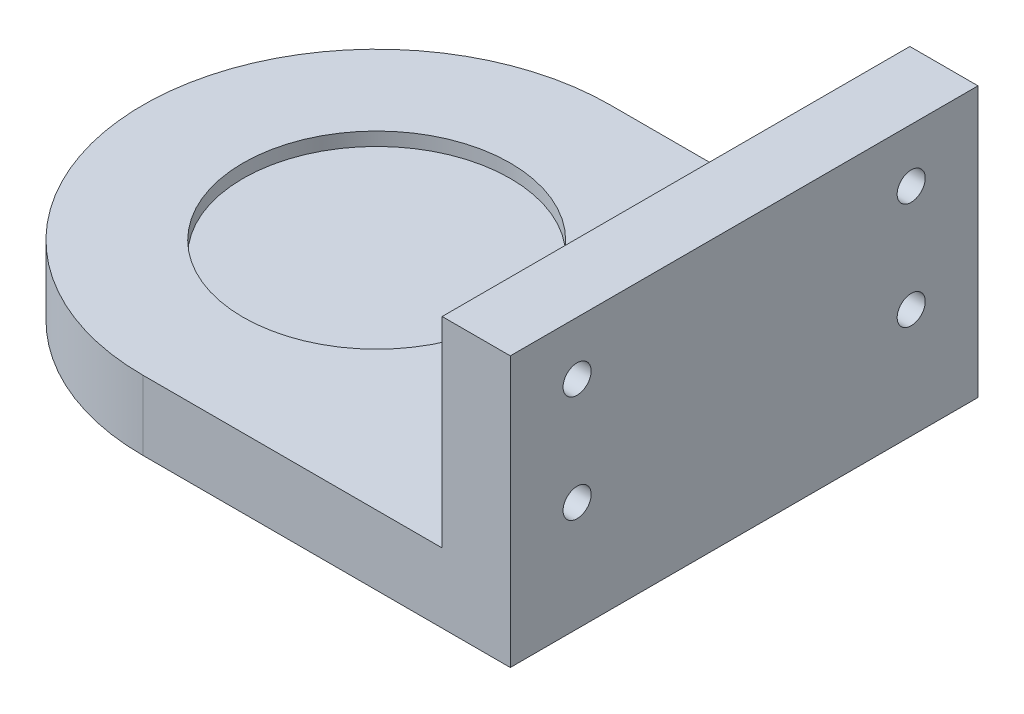
ISO-10303-21;
HEADER;
FILE_DESCRIPTION(('STEP AP214'),'2;1');
FILE_NAME('part.step','',(''),(''),'','','');
FILE_SCHEMA(('AUTOMOTIVE_DESIGN { 1 0 10303 214 1 1 1 1 }'));
ENDSEC;
DATA;
#1=APPLICATION_CONTEXT('core data for automotive mechanical design processes');
#2=APPLICATION_PROTOCOL_DEFINITION('international standard','automotive_design',2000,#1);
#3=PRODUCT_CONTEXT('',#1,'mechanical');
#4=PRODUCT('Part','Part','',(#3));
#5=PRODUCT_RELATED_PRODUCT_CATEGORY('part','',(#4));
#6=PRODUCT_DEFINITION_FORMATION('','',#4);
#7=PRODUCT_DEFINITION_CONTEXT('part definition',#1,'design');
#8=PRODUCT_DEFINITION('design','',#6,#7);
#9=PRODUCT_DEFINITION_SHAPE('','',#8);
#10=(LENGTH_UNIT() NAMED_UNIT(*) SI_UNIT(.MILLI.,.METRE.));
#11=(NAMED_UNIT(*) PLANE_ANGLE_UNIT() SI_UNIT($,.RADIAN.));
#12=(NAMED_UNIT(*) SI_UNIT($,.STERADIAN.) SOLID_ANGLE_UNIT());
#13=UNCERTAINTY_MEASURE_WITH_UNIT(LENGTH_MEASURE(1.E-05),#10,'distance_accuracy_value','');
#14=(GEOMETRIC_REPRESENTATION_CONTEXT(3) GLOBAL_UNCERTAINTY_ASSIGNED_CONTEXT((#13)) GLOBAL_UNIT_ASSIGNED_CONTEXT((#10,
#11,#12)) REPRESENTATION_CONTEXT('',''));
#15=CARTESIAN_POINT('',(0.,0.,0.));
#16=DIRECTION('',(0.,0.,1.));
#17=DIRECTION('',(1.,0.,0.));
#18=AXIS2_PLACEMENT_3D('',#15,#16,#17);
#19=CARTESIAN_POINT('',(0.,0.,0.));
#20=DIRECTION('',(0.,1.,0.));
#21=DIRECTION('',(0.,0.,1.));
#22=AXIS2_PLACEMENT_3D('',#19,#20,#21);
#23=PLANE('',#22);
#24=CARTESIAN_POINT('',(0.,0.,0.));
#25=DIRECTION('',(0.,1.,0.));
#26=DIRECTION('',(0.,0.,1.));
#27=AXIS2_PLACEMENT_3D('',#24,#25,#26);
#28=CIRCLE('',#27,20.);
#29=CARTESIAN_POINT('',(0.,0.,20.));
#30=VERTEX_POINT('',#29);
#31=EDGE_CURVE('E162',#30,#30,#28,.T.);
#32=ORIENTED_EDGE('',*,*,#31,.F.);
#33=EDGE_LOOP('',(#32));
#34=FACE_BOUND('',#33,.T.);
#35=DIRECTION('',(1.,0.,0.));
#36=VECTOR('',#35,1.);
#37=CARTESIAN_POINT('',(55.,0.,35.));
#38=LINE('',#37,#36);
#39=CARTESIAN_POINT('',(0.,0.,35.));
#40=VERTEX_POINT('',#39);
#41=CARTESIAN_POINT('',(44.8,0.,35.));
#42=VERTEX_POINT('',#41);
#43=EDGE_CURVE('E180',#40,#42,#38,.T.);
#44=ORIENTED_EDGE('',*,*,#43,.T.);
#45=DIRECTION('',(0.,0.,-1.));
#46=VECTOR('',#45,1.);
#47=CARTESIAN_POINT('',(44.8,0.,35.));
#48=LINE('',#47,#46);
#49=CARTESIAN_POINT('',(44.8,0.,-35.));
#50=VERTEX_POINT('',#49);
#51=EDGE_CURVE('E114',#42,#50,#48,.T.);
#52=ORIENTED_EDGE('',*,*,#51,.T.);
#53=DIRECTION('',(-1.,0.,0.));
#54=VECTOR('',#53,1.);
#55=CARTESIAN_POINT('',(0.,0.,-35.));
#56=LINE('',#55,#54);
#57=CARTESIAN_POINT('',(0.,0.,-35.));
#58=VERTEX_POINT('',#57);
#59=EDGE_CURVE('E71',#50,#58,#56,.T.);
#60=ORIENTED_EDGE('',*,*,#59,.T.);
#61=CARTESIAN_POINT('',(0.,0.,0.));
#62=DIRECTION('',(0.,1.,0.));
#63=DIRECTION('',(0.,0.,1.));
#64=AXIS2_PLACEMENT_3D('',#61,#62,#63);
#65=CIRCLE('',#64,35.);
#66=EDGE_CURVE('E135',#58,#40,#65,.T.);
#67=ORIENTED_EDGE('',*,*,#66,.T.);
#68=EDGE_LOOP('',(#44,#52,#60,#67));
#69=FACE_BOUND('',#68,.T.);
#70=ADVANCED_FACE('F31',(#34,#69),#23,.T.);
#71=CARTESIAN_POINT('',(0.,-10.4,0.));
#72=DIRECTION('',(0.,1.,0.));
#73=DIRECTION('',(0.,0.,1.));
#74=AXIS2_PLACEMENT_3D('',#71,#72,#73);
#75=CYLINDRICAL_SURFACE('',#74,35.);
#76=ORIENTED_EDGE('',*,*,#66,.F.);
#77=DIRECTION('',(0.,1.,0.));
#78=VECTOR('',#77,1.);
#79=CARTESIAN_POINT('',(0.,-10.4,-35.));
#80=LINE('',#79,#78);
#81=CARTESIAN_POINT('',(0.,-10.4,-35.));
#82=VERTEX_POINT('',#81);
#83=EDGE_CURVE('E11',#82,#58,#80,.T.);
#84=ORIENTED_EDGE('',*,*,#83,.F.);
#85=CARTESIAN_POINT('',(0.,-10.4,0.));
#86=DIRECTION('',(0.,1.,0.));
#87=DIRECTION('',(0.,0.,1.));
#88=AXIS2_PLACEMENT_3D('',#85,#86,#87);
#89=CIRCLE('',#88,35.);
#90=CARTESIAN_POINT('',(0.,-10.4,35.));
#91=VERTEX_POINT('',#90);
#92=EDGE_CURVE('E128',#82,#91,#89,.T.);
#93=ORIENTED_EDGE('',*,*,#92,.T.);
#94=DIRECTION('',(0.,1.,0.));
#95=VECTOR('',#94,1.);
#96=CARTESIAN_POINT('',(0.,-10.4,35.));
#97=LINE('',#96,#95);
#98=EDGE_CURVE('E77',#91,#40,#97,.T.);
#99=ORIENTED_EDGE('',*,*,#98,.T.);
#100=EDGE_LOOP('',(#76,#84,#93,#99));
#101=FACE_BOUND('',#100,.T.);
#102=ADVANCED_FACE('F33',(#101),#75,.T.);
#103=CARTESIAN_POINT('',(0.,-10.4,-35.));
#104=DIRECTION('',(0.,0.,-1.));
#105=DIRECTION('',(-1.,0.,0.));
#106=AXIS2_PLACEMENT_3D('',#103,#104,#105);
#107=PLANE('',#106);
#108=ORIENTED_EDGE('',*,*,#59,.F.);
#109=DIRECTION('',(0.,-1.,0.));
#110=VECTOR('',#109,1.);
#111=CARTESIAN_POINT('',(44.8,30.,-35.));
#112=LINE('',#111,#110);
#113=CARTESIAN_POINT('',(44.8,30.,-35.));
#114=VERTEX_POINT('',#113);
#115=EDGE_CURVE('E48',#114,#50,#112,.T.);
#116=ORIENTED_EDGE('',*,*,#115,.F.);
#117=DIRECTION('',(1.,0.,0.));
#118=VECTOR('',#117,1.);
#119=CARTESIAN_POINT('',(55.,30.,-35.));
#120=LINE('',#119,#118);
#121=CARTESIAN_POINT('',(55.,30.,-35.));
#122=VERTEX_POINT('',#121);
#123=EDGE_CURVE('E123',#114,#122,#120,.T.);
#124=ORIENTED_EDGE('',*,*,#123,.T.);
#125=DIRECTION('',(0.,1.,0.));
#126=VECTOR('',#125,1.);
#127=CARTESIAN_POINT('',(55.,-10.4,-35.));
#128=LINE('',#127,#126);
#129=CARTESIAN_POINT('',(55.,-10.4,-35.));
#130=VERTEX_POINT('',#129);
#131=EDGE_CURVE('E40',#130,#122,#128,.T.);
#132=ORIENTED_EDGE('',*,*,#131,.F.);
#133=DIRECTION('',(-1.,0.,0.));
#134=VECTOR('',#133,1.);
#135=CARTESIAN_POINT('',(0.,-10.4,-35.));
#136=LINE('',#135,#134);
#137=EDGE_CURVE('E188',#130,#82,#136,.T.);
#138=ORIENTED_EDGE('',*,*,#137,.T.);
#139=ORIENTED_EDGE('',*,*,#83,.T.);
#140=EDGE_LOOP('',(#108,#116,#124,#132,#138,#139));
#141=FACE_BOUND('',#140,.T.);
#142=ADVANCED_FACE('F196',(#141),#107,.T.);
#143=CARTESIAN_POINT('',(55.,-10.4,-35.));
#144=DIRECTION('',(1.,0.,0.));
#145=DIRECTION('',(0.,0.,-1.));
#146=AXIS2_PLACEMENT_3D('',#143,#144,#145);
#147=PLANE('',#146);
#148=CARTESIAN_POINT('',(55.,22.,25.));
#149=DIRECTION('',(1.,0.,0.));
#150=DIRECTION('',(0.,0.,1.));
#151=AXIS2_PLACEMENT_3D('',#148,#149,#150);
#152=CIRCLE('',#151,2.1);
#153=CARTESIAN_POINT('',(55.,22.,22.9));
#154=VERTEX_POINT('',#153);
#155=EDGE_CURVE('E157',#154,#154,#152,.T.);
#156=ORIENTED_EDGE('',*,*,#155,.F.);
#157=EDGE_LOOP('',(#156));
#158=FACE_BOUND('',#157,.T.);
#159=CARTESIAN_POINT('',(55.,6.00000000000001,25.));
#160=DIRECTION('',(1.,0.,0.));
#161=DIRECTION('',(0.,0.,1.));
#162=AXIS2_PLACEMENT_3D('',#159,#160,#161);
#163=CIRCLE('',#162,2.1);
#164=CARTESIAN_POINT('',(55.,6.00000000000001,22.9));
#165=VERTEX_POINT('',#164);
#166=EDGE_CURVE('E148',#165,#165,#163,.T.);
#167=ORIENTED_EDGE('',*,*,#166,.F.);
#168=EDGE_LOOP('',(#167));
#169=FACE_BOUND('',#168,.T.);
#170=CARTESIAN_POINT('',(55.,6.00000000000001,-25.));
#171=DIRECTION('',(1.,0.,0.));
#172=DIRECTION('',(0.,0.,-1.));
#173=AXIS2_PLACEMENT_3D('',#170,#171,#172);
#174=CIRCLE('',#173,2.1);
#175=CARTESIAN_POINT('',(55.,6.00000000000001,-27.1));
#176=VERTEX_POINT('',#175);
#177=EDGE_CURVE('E145',#176,#176,#174,.T.);
#178=ORIENTED_EDGE('',*,*,#177,.F.);
#179=EDGE_LOOP('',(#178));
#180=FACE_BOUND('',#179,.T.);
#181=CARTESIAN_POINT('',(55.,22.,-25.));
#182=DIRECTION('',(1.,0.,0.));
#183=DIRECTION('',(0.,0.,-1.));
#184=AXIS2_PLACEMENT_3D('',#181,#182,#183);
#185=CIRCLE('',#184,2.1);
#186=CARTESIAN_POINT('',(55.,22.,-27.1));
#187=VERTEX_POINT('',#186);
#188=EDGE_CURVE('E119',#187,#187,#185,.T.);
#189=ORIENTED_EDGE('',*,*,#188,.F.);
#190=EDGE_LOOP('',(#189));
#191=FACE_BOUND('',#190,.T.);
#192=ORIENTED_EDGE('',*,*,#131,.T.);
#193=DIRECTION('',(0.,0.,1.));
#194=VECTOR('',#193,1.);
#195=CARTESIAN_POINT('',(55.,30.,35.));
#196=LINE('',#195,#194);
#197=CARTESIAN_POINT('',(55.,30.,35.));
#198=VERTEX_POINT('',#197);
#199=EDGE_CURVE('E109',#122,#198,#196,.T.);
#200=ORIENTED_EDGE('',*,*,#199,.T.);
#201=DIRECTION('',(0.,1.,0.));
#202=VECTOR('',#201,1.);
#203=CARTESIAN_POINT('',(55.,-10.4,35.));
#204=LINE('',#203,#202);
#205=CARTESIAN_POINT('',(55.,-10.4,35.));
#206=VERTEX_POINT('',#205);
#207=EDGE_CURVE('E94',#206,#198,#204,.T.);
#208=ORIENTED_EDGE('',*,*,#207,.F.);
#209=DIRECTION('',(0.,0.,-1.));
#210=VECTOR('',#209,1.);
#211=CARTESIAN_POINT('',(55.,-10.4,-35.));
#212=LINE('',#211,#210);
#213=EDGE_CURVE('E191',#206,#130,#212,.T.);
#214=ORIENTED_EDGE('',*,*,#213,.T.);
#215=EDGE_LOOP('',(#192,#200,#208,#214));
#216=FACE_BOUND('',#215,.T.);
#217=ADVANCED_FACE('F113',(#158,#169,#180,#191,#216),#147,.T.);
#218=CARTESIAN_POINT('',(55.,-10.4,35.));
#219=DIRECTION('',(0.,0.,1.));
#220=DIRECTION('',(1.,0.,0.));
#221=AXIS2_PLACEMENT_3D('',#218,#219,#220);
#222=PLANE('',#221);
#223=ORIENTED_EDGE('',*,*,#43,.F.);
#224=ORIENTED_EDGE('',*,*,#98,.F.);
#225=DIRECTION('',(1.,0.,0.));
#226=VECTOR('',#225,1.);
#227=CARTESIAN_POINT('',(55.,-10.4,35.));
#228=LINE('',#227,#226);
#229=EDGE_CURVE('E98',#91,#206,#228,.T.);
#230=ORIENTED_EDGE('',*,*,#229,.T.);
#231=ORIENTED_EDGE('',*,*,#207,.T.);
#232=DIRECTION('',(-1.,0.,0.));
#233=VECTOR('',#232,1.);
#234=CARTESIAN_POINT('',(55.,30.,35.));
#235=LINE('',#234,#233);
#236=CARTESIAN_POINT('',(44.8,30.,35.));
#237=VERTEX_POINT('',#236);
#238=EDGE_CURVE('E97',#198,#237,#235,.T.);
#239=ORIENTED_EDGE('',*,*,#238,.T.);
#240=DIRECTION('',(0.,-1.,0.));
#241=VECTOR('',#240,1.);
#242=CARTESIAN_POINT('',(44.8,30.,35.));
#243=LINE('',#242,#241);
#244=EDGE_CURVE('E125',#237,#42,#243,.T.);
#245=ORIENTED_EDGE('',*,*,#244,.T.);
#246=EDGE_LOOP('',(#223,#224,#230,#231,#239,#245));
#247=FACE_BOUND('',#246,.T.);
#248=ADVANCED_FACE('F96',(#247),#222,.T.);
#249=CARTESIAN_POINT('',(0.,-10.4,0.));
#250=DIRECTION('',(0.,1.,0.));
#251=DIRECTION('',(0.,0.,1.));
#252=AXIS2_PLACEMENT_3D('',#249,#250,#251);
#253=PLANE('',#252);
#254=ORIENTED_EDGE('',*,*,#92,.F.);
#255=ORIENTED_EDGE('',*,*,#137,.F.);
#256=ORIENTED_EDGE('',*,*,#213,.F.);
#257=ORIENTED_EDGE('',*,*,#229,.F.);
#258=EDGE_LOOP('',(#254,#255,#256,#257));
#259=FACE_BOUND('',#258,.T.);
#260=ADVANCED_FACE('F194',(#259),#253,.F.);
#261=CARTESIAN_POINT('',(44.8,30.,35.));
#262=DIRECTION('',(-1.,0.,0.));
#263=DIRECTION('',(0.,0.,1.));
#264=AXIS2_PLACEMENT_3D('',#261,#262,#263);
#265=PLANE('',#264);
#266=CARTESIAN_POINT('',(44.8,22.,25.));
#267=DIRECTION('',(-1.,0.,0.));
#268=DIRECTION('',(0.,0.,1.));
#269=AXIS2_PLACEMENT_3D('',#266,#267,#268);
#270=CIRCLE('',#269,2.1);
#271=CARTESIAN_POINT('',(44.8,22.,22.9));
#272=VERTEX_POINT('',#271);
#273=EDGE_CURVE('E35',#272,#272,#270,.T.);
#274=ORIENTED_EDGE('',*,*,#273,.F.);
#275=EDGE_LOOP('',(#274));
#276=FACE_BOUND('',#275,.T.);
#277=CARTESIAN_POINT('',(44.8,6.00000000000001,25.));
#278=DIRECTION('',(-1.,0.,0.));
#279=DIRECTION('',(0.,0.,1.));
#280=AXIS2_PLACEMENT_3D('',#277,#278,#279);
#281=CIRCLE('',#280,2.1);
#282=CARTESIAN_POINT('',(44.8,6.00000000000001,22.9));
#283=VERTEX_POINT('',#282);
#284=EDGE_CURVE('E146',#283,#283,#281,.T.);
#285=ORIENTED_EDGE('',*,*,#284,.F.);
#286=EDGE_LOOP('',(#285));
#287=FACE_BOUND('',#286,.T.);
#288=CARTESIAN_POINT('',(44.8,6.00000000000001,-25.));
#289=DIRECTION('',(-1.,0.,0.));
#290=DIRECTION('',(0.,0.,1.));
#291=AXIS2_PLACEMENT_3D('',#288,#289,#290);
#292=CIRCLE('',#291,2.1);
#293=CARTESIAN_POINT('',(44.8,6.00000000000001,-27.1));
#294=VERTEX_POINT('',#293);
#295=EDGE_CURVE('E143',#294,#294,#292,.T.);
#296=ORIENTED_EDGE('',*,*,#295,.F.);
#297=EDGE_LOOP('',(#296));
#298=FACE_BOUND('',#297,.T.);
#299=CARTESIAN_POINT('',(44.8,22.,-25.));
#300=DIRECTION('',(-1.,0.,0.));
#301=DIRECTION('',(0.,0.,1.));
#302=AXIS2_PLACEMENT_3D('',#299,#300,#301);
#303=CIRCLE('',#302,2.1);
#304=CARTESIAN_POINT('',(44.8,22.,-27.1));
#305=VERTEX_POINT('',#304);
#306=EDGE_CURVE('E116',#305,#305,#303,.T.);
#307=ORIENTED_EDGE('',*,*,#306,.F.);
#308=EDGE_LOOP('',(#307));
#309=FACE_BOUND('',#308,.T.);
#310=ORIENTED_EDGE('',*,*,#51,.F.);
#311=ORIENTED_EDGE('',*,*,#244,.F.);
#312=DIRECTION('',(0.,0.,-1.));
#313=VECTOR('',#312,1.);
#314=CARTESIAN_POINT('',(44.8,30.,35.));
#315=LINE('',#314,#313);
#316=EDGE_CURVE('E111',#237,#114,#315,.T.);
#317=ORIENTED_EDGE('',*,*,#316,.T.);
#318=ORIENTED_EDGE('',*,*,#115,.T.);
#319=EDGE_LOOP('',(#310,#311,#317,#318));
#320=FACE_BOUND('',#319,.T.);
#321=ADVANCED_FACE('F197',(#276,#287,#298,#309,#320),#265,.T.);
#322=CARTESIAN_POINT('',(55.,30.,-35.));
#323=DIRECTION('',(0.,1.,0.));
#324=DIRECTION('',(0.,0.,1.));
#325=AXIS2_PLACEMENT_3D('',#322,#323,#324);
#326=PLANE('',#325);
#327=ORIENTED_EDGE('',*,*,#199,.F.);
#328=ORIENTED_EDGE('',*,*,#123,.F.);
#329=ORIENTED_EDGE('',*,*,#316,.F.);
#330=ORIENTED_EDGE('',*,*,#238,.F.);
#331=EDGE_LOOP('',(#327,#328,#329,#330));
#332=FACE_BOUND('',#331,.T.);
#333=ADVANCED_FACE('F107',(#332),#326,.T.);
#334=CARTESIAN_POINT('',(-35.,22.,-25.));
#335=DIRECTION('',(1.,0.,0.));
#336=DIRECTION('',(0.,0.,-1.));
#337=AXIS2_PLACEMENT_3D('',#334,#335,#336);
#338=CYLINDRICAL_SURFACE('',#337,2.1);
#339=CARTESIAN_POINT('',(44.8,22.,-27.1));
#340=CARTESIAN_POINT('',(44.90625,22.,-27.1));
#341=CARTESIAN_POINT('',(45.0125,22.,-27.1));
#342=CARTESIAN_POINT('',(45.225,22.,-27.1));
#343=CARTESIAN_POINT('',(45.33125,22.,-27.1));
#344=CARTESIAN_POINT('',(45.54375,22.,-27.1));
#345=CARTESIAN_POINT('',(45.65,22.,-27.1));
#346=CARTESIAN_POINT('',(45.8625,22.,-27.1));
#347=CARTESIAN_POINT('',(45.96875,22.,-27.1));
#348=CARTESIAN_POINT('',(46.18125,22.,-27.1));
#349=CARTESIAN_POINT('',(46.2875,22.,-27.1));
#350=CARTESIAN_POINT('',(46.5,22.,-27.1));
#351=CARTESIAN_POINT('',(46.60625,22.,-27.1));
#352=CARTESIAN_POINT('',(46.81875,22.,-27.1));
#353=CARTESIAN_POINT('',(46.925,22.,-27.1));
#354=CARTESIAN_POINT('',(47.1375,22.,-27.1));
#355=CARTESIAN_POINT('',(47.24375,22.,-27.1));
#356=CARTESIAN_POINT('',(47.45625,22.,-27.1));
#357=CARTESIAN_POINT('',(47.5625,22.,-27.1));
#358=CARTESIAN_POINT('',(47.775,22.,-27.1));
#359=CARTESIAN_POINT('',(47.88125,22.,-27.1));
#360=CARTESIAN_POINT('',(48.09375,22.,-27.1));
#361=CARTESIAN_POINT('',(48.2,22.,-27.1));
#362=CARTESIAN_POINT('',(48.4125,22.,-27.1));
#363=CARTESIAN_POINT('',(48.51875,22.,-27.1));
#364=CARTESIAN_POINT('',(48.73125,22.,-27.1));
#365=CARTESIAN_POINT('',(48.8375,22.,-27.1));
#366=CARTESIAN_POINT('',(49.05,22.,-27.1));
#367=CARTESIAN_POINT('',(49.15625,22.,-27.1));
#368=CARTESIAN_POINT('',(49.36875,22.,-27.1));
#369=CARTESIAN_POINT('',(49.475,22.,-27.1));
#370=CARTESIAN_POINT('',(49.6875,22.,-27.1));
#371=CARTESIAN_POINT('',(49.79375,22.,-27.1));
#372=CARTESIAN_POINT('',(50.00625,22.,-27.1));
#373=CARTESIAN_POINT('',(50.1125,22.,-27.1));
#374=CARTESIAN_POINT('',(50.325,22.,-27.1));
#375=CARTESIAN_POINT('',(50.43125,22.,-27.1));
#376=CARTESIAN_POINT('',(50.64375,22.,-27.1));
#377=CARTESIAN_POINT('',(50.75,22.,-27.1));
#378=CARTESIAN_POINT('',(50.9625,22.,-27.1));
#379=CARTESIAN_POINT('',(51.06875,22.,-27.1));
#380=CARTESIAN_POINT('',(51.28125,22.,-27.1));
#381=CARTESIAN_POINT('',(51.3875,22.,-27.1));
#382=CARTESIAN_POINT('',(51.6,22.,-27.1));
#383=CARTESIAN_POINT('',(51.70625,22.,-27.1));
#384=CARTESIAN_POINT('',(51.91875,22.,-27.1));
#385=CARTESIAN_POINT('',(52.025,22.,-27.1));
#386=CARTESIAN_POINT('',(52.2375,22.,-27.1));
#387=CARTESIAN_POINT('',(52.34375,22.,-27.1));
#388=CARTESIAN_POINT('',(52.55625,22.,-27.1));
#389=CARTESIAN_POINT('',(52.6625,22.,-27.1));
#390=CARTESIAN_POINT('',(52.875,22.,-27.1));
#391=CARTESIAN_POINT('',(52.98125,22.,-27.1));
#392=CARTESIAN_POINT('',(53.19375,22.,-27.1));
#393=CARTESIAN_POINT('',(53.3,22.,-27.1));
#394=CARTESIAN_POINT('',(53.5125,22.,-27.1));
#395=CARTESIAN_POINT('',(53.61875,22.,-27.1));
#396=CARTESIAN_POINT('',(53.83125,22.,-27.1));
#397=CARTESIAN_POINT('',(53.9375,22.,-27.1));
#398=CARTESIAN_POINT('',(54.15,22.,-27.1));
#399=CARTESIAN_POINT('',(54.25625,22.,-27.1));
#400=CARTESIAN_POINT('',(54.46875,22.,-27.1));
#401=CARTESIAN_POINT('',(54.575,22.,-27.1));
#402=CARTESIAN_POINT('',(54.7875,22.,-27.1));
#403=CARTESIAN_POINT('',(54.89375,22.,-27.1));
#404=CARTESIAN_POINT('',(55.,22.,-27.1));
#405=B_SPLINE_CURVE_WITH_KNOTS('',3,(#339,#340,#341,#342,#343,#344,#345,#346,#347,#348,#349,
#350,#351,#352,#353,#354,#355,#356,#357,#358,#359,#360,#361,#362,#363,#364,#365,#366,#367,#368,
#369,#370,#371,#372,#373,#374,#375,#376,#377,#378,#379,#380,#381,#382,#383,#384,#385,#386,#387,
#388,#389,#390,#391,#392,#393,#394,#395,#396,#397,#398,#399,#400,#401,#402,#403,#404),
.UNSPECIFIED.,.F.,.F.,(4,2,2,2,2,2,2,2,2,2,2,2,2,2,2,2,2,2,2,2,2,2,2,2,2,2,2,2,2,2,2,2,4),(0.,
0.318750000000007,0.637499999999999,0.956249999999992,1.275,1.59375,1.9125,2.23124999999999,
2.55,2.86875,3.1875,3.50624999999999,3.82499999999999,4.14375,4.46249999999999,4.78124999999999,
5.09999999999999,5.41875,5.73749999999999,6.05624999999999,6.37499999999999,6.69375,
7.01249999999999,7.33124999999998,7.64999999999999,7.96875,8.28749999999999,8.60624999999998,
8.92499999999999,9.24375,9.56249999999999,9.88124999999998,10.2),.UNSPECIFIED.);
#406=EDGE_CURVE('BSEAM205',#305,#187,#405,.T.);
#407=ORIENTED_EDGE('',*,*,#306,.T.);
#408=ORIENTED_EDGE('',*,*,#188,.T.);
#409=ORIENTED_EDGE('',*,*,#406,.T.);
#410=ORIENTED_EDGE('',*,*,#406,.F.);
#411=EDGE_LOOP('',(#407,#409,#408,#410));
#412=FACE_BOUND('',#411,.T.);
#413=ADVANCED_FACE('F205',(#412),#338,.F.);
#414=CARTESIAN_POINT('',(-35.,6.00000000000001,-25.));
#415=DIRECTION('',(1.,0.,0.));
#416=DIRECTION('',(0.,0.,-1.));
#417=AXIS2_PLACEMENT_3D('',#414,#415,#416);
#418=CYLINDRICAL_SURFACE('',#417,2.1);
#419=CARTESIAN_POINT('',(44.8,6.00000000000001,-27.1));
#420=CARTESIAN_POINT('',(44.90625,6.00000000000001,-27.1));
#421=CARTESIAN_POINT('',(45.0125,6.00000000000001,-27.1));
#422=CARTESIAN_POINT('',(45.225,6.00000000000001,-27.1));
#423=CARTESIAN_POINT('',(45.33125,6.00000000000001,-27.1));
#424=CARTESIAN_POINT('',(45.54375,6.00000000000001,-27.1));
#425=CARTESIAN_POINT('',(45.65,6.00000000000001,-27.1));
#426=CARTESIAN_POINT('',(45.8625,6.00000000000001,-27.1));
#427=CARTESIAN_POINT('',(45.96875,6.00000000000001,-27.1));
#428=CARTESIAN_POINT('',(46.18125,6.00000000000001,-27.1));
#429=CARTESIAN_POINT('',(46.2875,6.00000000000001,-27.1));
#430=CARTESIAN_POINT('',(46.5,6.00000000000001,-27.1));
#431=CARTESIAN_POINT('',(46.60625,6.00000000000001,-27.1));
#432=CARTESIAN_POINT('',(46.81875,6.00000000000001,-27.1));
#433=CARTESIAN_POINT('',(46.925,6.00000000000001,-27.1));
#434=CARTESIAN_POINT('',(47.1375,6.00000000000001,-27.1));
#435=CARTESIAN_POINT('',(47.24375,6.00000000000001,-27.1));
#436=CARTESIAN_POINT('',(47.45625,6.00000000000001,-27.1));
#437=CARTESIAN_POINT('',(47.5625,6.00000000000001,-27.1));
#438=CARTESIAN_POINT('',(47.775,6.00000000000001,-27.1));
#439=CARTESIAN_POINT('',(47.88125,6.00000000000001,-27.1));
#440=CARTESIAN_POINT('',(48.09375,6.00000000000001,-27.1));
#441=CARTESIAN_POINT('',(48.2,6.00000000000001,-27.1));
#442=CARTESIAN_POINT('',(48.4125,6.00000000000001,-27.1));
#443=CARTESIAN_POINT('',(48.51875,6.00000000000001,-27.1));
#444=CARTESIAN_POINT('',(48.73125,6.00000000000001,-27.1));
#445=CARTESIAN_POINT('',(48.8375,6.00000000000001,-27.1));
#446=CARTESIAN_POINT('',(49.05,6.00000000000001,-27.1));
#447=CARTESIAN_POINT('',(49.15625,6.00000000000001,-27.1));
#448=CARTESIAN_POINT('',(49.36875,6.00000000000001,-27.1));
#449=CARTESIAN_POINT('',(49.475,6.00000000000001,-27.1));
#450=CARTESIAN_POINT('',(49.6875,6.00000000000001,-27.1));
#451=CARTESIAN_POINT('',(49.79375,6.00000000000001,-27.1));
#452=CARTESIAN_POINT('',(50.00625,6.00000000000001,-27.1));
#453=CARTESIAN_POINT('',(50.1125,6.00000000000001,-27.1));
#454=CARTESIAN_POINT('',(50.325,6.00000000000001,-27.1));
#455=CARTESIAN_POINT('',(50.43125,6.00000000000001,-27.1));
#456=CARTESIAN_POINT('',(50.64375,6.00000000000001,-27.1));
#457=CARTESIAN_POINT('',(50.75,6.00000000000001,-27.1));
#458=CARTESIAN_POINT('',(50.9625,6.00000000000001,-27.1));
#459=CARTESIAN_POINT('',(51.06875,6.00000000000001,-27.1));
#460=CARTESIAN_POINT('',(51.28125,6.00000000000001,-27.1));
#461=CARTESIAN_POINT('',(51.3875,6.00000000000001,-27.1));
#462=CARTESIAN_POINT('',(51.6,6.00000000000001,-27.1));
#463=CARTESIAN_POINT('',(51.70625,6.00000000000001,-27.1));
#464=CARTESIAN_POINT('',(51.91875,6.00000000000001,-27.1));
#465=CARTESIAN_POINT('',(52.025,6.00000000000001,-27.1));
#466=CARTESIAN_POINT('',(52.2375,6.00000000000001,-27.1));
#467=CARTESIAN_POINT('',(52.34375,6.00000000000001,-27.1));
#468=CARTESIAN_POINT('',(52.55625,6.00000000000001,-27.1));
#469=CARTESIAN_POINT('',(52.6625,6.00000000000001,-27.1));
#470=CARTESIAN_POINT('',(52.875,6.00000000000001,-27.1));
#471=CARTESIAN_POINT('',(52.98125,6.00000000000001,-27.1));
#472=CARTESIAN_POINT('',(53.19375,6.00000000000001,-27.1));
#473=CARTESIAN_POINT('',(53.3,6.00000000000001,-27.1));
#474=CARTESIAN_POINT('',(53.5125,6.00000000000001,-27.1));
#475=CARTESIAN_POINT('',(53.61875,6.00000000000001,-27.1));
#476=CARTESIAN_POINT('',(53.83125,6.00000000000001,-27.1));
#477=CARTESIAN_POINT('',(53.9375,6.00000000000001,-27.1));
#478=CARTESIAN_POINT('',(54.15,6.00000000000001,-27.1));
#479=CARTESIAN_POINT('',(54.25625,6.00000000000001,-27.1));
#480=CARTESIAN_POINT('',(54.46875,6.00000000000001,-27.1));
#481=CARTESIAN_POINT('',(54.575,6.00000000000001,-27.1));
#482=CARTESIAN_POINT('',(54.7875,6.00000000000001,-27.1));
#483=CARTESIAN_POINT('',(54.89375,6.00000000000001,-27.1));
#484=CARTESIAN_POINT('',(55.,6.00000000000001,-27.1));
#485=B_SPLINE_CURVE_WITH_KNOTS('',3,(#419,#420,#421,#422,#423,#424,#425,#426,#427,#428,#429,
#430,#431,#432,#433,#434,#435,#436,#437,#438,#439,#440,#441,#442,#443,#444,#445,#446,#447,#448,
#449,#450,#451,#452,#453,#454,#455,#456,#457,#458,#459,#460,#461,#462,#463,#464,#465,#466,#467,
#468,#469,#470,#471,#472,#473,#474,#475,#476,#477,#478,#479,#480,#481,#482,#483,#484),
.UNSPECIFIED.,.F.,.F.,(4,2,2,2,2,2,2,2,2,2,2,2,2,2,2,2,2,2,2,2,2,2,2,2,2,2,2,2,2,2,2,2,4),(0.,
0.318750000000007,0.637499999999999,0.956249999999992,1.275,1.59375,1.9125,2.23124999999999,
2.55,2.86875,3.1875,3.50624999999999,3.82499999999999,4.14375,4.46249999999999,4.78124999999999,
5.09999999999999,5.41875,5.73749999999999,6.05624999999999,6.37499999999999,6.69375,
7.01249999999999,7.33124999999998,7.64999999999999,7.96875,8.28749999999999,8.60624999999998,
8.92499999999999,9.24375,9.56249999999999,9.88124999999998,10.2),.UNSPECIFIED.);
#486=EDGE_CURVE('BSEAM275',#294,#176,#485,.T.);
#487=ORIENTED_EDGE('',*,*,#295,.T.);
#488=ORIENTED_EDGE('',*,*,#177,.T.);
#489=ORIENTED_EDGE('',*,*,#486,.T.);
#490=ORIENTED_EDGE('',*,*,#486,.F.);
#491=EDGE_LOOP('',(#487,#489,#488,#490));
#492=FACE_BOUND('',#491,.T.);
#493=ADVANCED_FACE('F275',(#492),#418,.F.);
#494=CARTESIAN_POINT('',(-35.,6.00000000000001,25.));
#495=DIRECTION('',(1.,0.,0.));
#496=DIRECTION('',(0.,0.,-1.));
#497=AXIS2_PLACEMENT_3D('',#494,#495,#496);
#498=CYLINDRICAL_SURFACE('',#497,2.1);
#499=CARTESIAN_POINT('',(44.8,6.00000000000001,22.9));
#500=CARTESIAN_POINT('',(44.90625,6.00000000000001,22.9));
#501=CARTESIAN_POINT('',(45.0125,6.00000000000001,22.9));
#502=CARTESIAN_POINT('',(45.225,6.00000000000001,22.9));
#503=CARTESIAN_POINT('',(45.33125,6.00000000000001,22.9));
#504=CARTESIAN_POINT('',(45.54375,6.00000000000001,22.9));
#505=CARTESIAN_POINT('',(45.65,6.00000000000001,22.9));
#506=CARTESIAN_POINT('',(45.8625,6.00000000000001,22.9));
#507=CARTESIAN_POINT('',(45.96875,6.00000000000001,22.9));
#508=CARTESIAN_POINT('',(46.18125,6.00000000000001,22.9));
#509=CARTESIAN_POINT('',(46.2875,6.00000000000001,22.9));
#510=CARTESIAN_POINT('',(46.5,6.00000000000001,22.9));
#511=CARTESIAN_POINT('',(46.60625,6.00000000000001,22.9));
#512=CARTESIAN_POINT('',(46.81875,6.00000000000001,22.9));
#513=CARTESIAN_POINT('',(46.925,6.00000000000001,22.9));
#514=CARTESIAN_POINT('',(47.1375,6.00000000000001,22.9));
#515=CARTESIAN_POINT('',(47.24375,6.00000000000001,22.9));
#516=CARTESIAN_POINT('',(47.45625,6.00000000000001,22.9));
#517=CARTESIAN_POINT('',(47.5625,6.00000000000001,22.9));
#518=CARTESIAN_POINT('',(47.775,6.00000000000001,22.9));
#519=CARTESIAN_POINT('',(47.88125,6.00000000000001,22.9));
#520=CARTESIAN_POINT('',(48.09375,6.00000000000001,22.9));
#521=CARTESIAN_POINT('',(48.2,6.00000000000001,22.9));
#522=CARTESIAN_POINT('',(48.4125,6.00000000000001,22.9));
#523=CARTESIAN_POINT('',(48.51875,6.00000000000001,22.9));
#524=CARTESIAN_POINT('',(48.73125,6.00000000000001,22.9));
#525=CARTESIAN_POINT('',(48.8375,6.00000000000001,22.9));
#526=CARTESIAN_POINT('',(49.05,6.00000000000001,22.9));
#527=CARTESIAN_POINT('',(49.15625,6.00000000000001,22.9));
#528=CARTESIAN_POINT('',(49.36875,6.00000000000001,22.9));
#529=CARTESIAN_POINT('',(49.475,6.00000000000001,22.9));
#530=CARTESIAN_POINT('',(49.6875,6.00000000000001,22.9));
#531=CARTESIAN_POINT('',(49.79375,6.00000000000001,22.9));
#532=CARTESIAN_POINT('',(50.00625,6.00000000000001,22.9));
#533=CARTESIAN_POINT('',(50.1125,6.00000000000001,22.9));
#534=CARTESIAN_POINT('',(50.325,6.00000000000001,22.9));
#535=CARTESIAN_POINT('',(50.43125,6.00000000000001,22.9));
#536=CARTESIAN_POINT('',(50.64375,6.00000000000001,22.9));
#537=CARTESIAN_POINT('',(50.75,6.00000000000001,22.9));
#538=CARTESIAN_POINT('',(50.9625,6.00000000000001,22.9));
#539=CARTESIAN_POINT('',(51.06875,6.00000000000001,22.9));
#540=CARTESIAN_POINT('',(51.28125,6.00000000000001,22.9));
#541=CARTESIAN_POINT('',(51.3875,6.00000000000001,22.9));
#542=CARTESIAN_POINT('',(51.6,6.00000000000001,22.9));
#543=CARTESIAN_POINT('',(51.70625,6.00000000000001,22.9));
#544=CARTESIAN_POINT('',(51.91875,6.00000000000001,22.9));
#545=CARTESIAN_POINT('',(52.025,6.00000000000001,22.9));
#546=CARTESIAN_POINT('',(52.2375,6.00000000000001,22.9));
#547=CARTESIAN_POINT('',(52.34375,6.00000000000001,22.9));
#548=CARTESIAN_POINT('',(52.55625,6.00000000000001,22.9));
#549=CARTESIAN_POINT('',(52.6625,6.00000000000001,22.9));
#550=CARTESIAN_POINT('',(52.875,6.00000000000001,22.9));
#551=CARTESIAN_POINT('',(52.98125,6.00000000000001,22.9));
#552=CARTESIAN_POINT('',(53.19375,6.00000000000001,22.9));
#553=CARTESIAN_POINT('',(53.3,6.00000000000001,22.9));
#554=CARTESIAN_POINT('',(53.5125,6.00000000000001,22.9));
#555=CARTESIAN_POINT('',(53.61875,6.00000000000001,22.9));
#556=CARTESIAN_POINT('',(53.83125,6.00000000000001,22.9));
#557=CARTESIAN_POINT('',(53.9375,6.00000000000001,22.9));
#558=CARTESIAN_POINT('',(54.15,6.00000000000001,22.9));
#559=CARTESIAN_POINT('',(54.25625,6.00000000000001,22.9));
#560=CARTESIAN_POINT('',(54.46875,6.00000000000001,22.9));
#561=CARTESIAN_POINT('',(54.575,6.00000000000001,22.9));
#562=CARTESIAN_POINT('',(54.7875,6.00000000000001,22.9));
#563=CARTESIAN_POINT('',(54.89375,6.00000000000001,22.9));
#564=CARTESIAN_POINT('',(55.,6.00000000000001,22.9));
#565=B_SPLINE_CURVE_WITH_KNOTS('',3,(#499,#500,#501,#502,#503,#504,#505,#506,#507,#508,#509,
#510,#511,#512,#513,#514,#515,#516,#517,#518,#519,#520,#521,#522,#523,#524,#525,#526,#527,#528,
#529,#530,#531,#532,#533,#534,#535,#536,#537,#538,#539,#540,#541,#542,#543,#544,#545,#546,#547,
#548,#549,#550,#551,#552,#553,#554,#555,#556,#557,#558,#559,#560,#561,#562,#563,#564),
.UNSPECIFIED.,.F.,.F.,(4,2,2,2,2,2,2,2,2,2,2,2,2,2,2,2,2,2,2,2,2,2,2,2,2,2,2,2,2,2,2,2,4),(0.,
0.318750000000007,0.637499999999999,0.956249999999992,1.275,1.59375,1.9125,2.23124999999999,
2.55,2.86875,3.1875,3.50624999999999,3.82499999999999,4.14375,4.46249999999999,4.78124999999999,
5.09999999999999,5.41875,5.73749999999999,6.05624999999999,6.37499999999999,6.69375,
7.01249999999999,7.33124999999998,7.64999999999999,7.96875,8.28749999999999,8.60624999999998,
8.92499999999999,9.24375,9.56249999999999,9.88124999999998,10.2),.UNSPECIFIED.);
#566=EDGE_CURVE('BSEAM271',#283,#165,#565,.T.);
#567=ORIENTED_EDGE('',*,*,#284,.T.);
#568=ORIENTED_EDGE('',*,*,#166,.T.);
#569=ORIENTED_EDGE('',*,*,#566,.T.);
#570=ORIENTED_EDGE('',*,*,#566,.F.);
#571=EDGE_LOOP('',(#567,#569,#568,#570));
#572=FACE_BOUND('',#571,.T.);
#573=ADVANCED_FACE('F271',(#572),#498,.F.);
#574=CARTESIAN_POINT('',(-35.,22.,25.));
#575=DIRECTION('',(1.,0.,0.));
#576=DIRECTION('',(0.,0.,-1.));
#577=AXIS2_PLACEMENT_3D('',#574,#575,#576);
#578=CYLINDRICAL_SURFACE('',#577,2.1);
#579=CARTESIAN_POINT('',(44.8,22.,22.9));
#580=CARTESIAN_POINT('',(44.90625,22.,22.9));
#581=CARTESIAN_POINT('',(45.0125,22.,22.9));
#582=CARTESIAN_POINT('',(45.225,22.,22.9));
#583=CARTESIAN_POINT('',(45.33125,22.,22.9));
#584=CARTESIAN_POINT('',(45.54375,22.,22.9));
#585=CARTESIAN_POINT('',(45.65,22.,22.9));
#586=CARTESIAN_POINT('',(45.8625,22.,22.9));
#587=CARTESIAN_POINT('',(45.96875,22.,22.9));
#588=CARTESIAN_POINT('',(46.18125,22.,22.9));
#589=CARTESIAN_POINT('',(46.2875,22.,22.9));
#590=CARTESIAN_POINT('',(46.5,22.,22.9));
#591=CARTESIAN_POINT('',(46.60625,22.,22.9));
#592=CARTESIAN_POINT('',(46.81875,22.,22.9));
#593=CARTESIAN_POINT('',(46.925,22.,22.9));
#594=CARTESIAN_POINT('',(47.1375,22.,22.9));
#595=CARTESIAN_POINT('',(47.24375,22.,22.9));
#596=CARTESIAN_POINT('',(47.45625,22.,22.9));
#597=CARTESIAN_POINT('',(47.5625,22.,22.9));
#598=CARTESIAN_POINT('',(47.775,22.,22.9));
#599=CARTESIAN_POINT('',(47.88125,22.,22.9));
#600=CARTESIAN_POINT('',(48.09375,22.,22.9));
#601=CARTESIAN_POINT('',(48.2,22.,22.9));
#602=CARTESIAN_POINT('',(48.4125,22.,22.9));
#603=CARTESIAN_POINT('',(48.51875,22.,22.9));
#604=CARTESIAN_POINT('',(48.73125,22.,22.9));
#605=CARTESIAN_POINT('',(48.8375,22.,22.9));
#606=CARTESIAN_POINT('',(49.05,22.,22.9));
#607=CARTESIAN_POINT('',(49.15625,22.,22.9));
#608=CARTESIAN_POINT('',(49.36875,22.,22.9));
#609=CARTESIAN_POINT('',(49.475,22.,22.9));
#610=CARTESIAN_POINT('',(49.6875,22.,22.9));
#611=CARTESIAN_POINT('',(49.79375,22.,22.9));
#612=CARTESIAN_POINT('',(50.00625,22.,22.9));
#613=CARTESIAN_POINT('',(50.1125,22.,22.9));
#614=CARTESIAN_POINT('',(50.325,22.,22.9));
#615=CARTESIAN_POINT('',(50.43125,22.,22.9));
#616=CARTESIAN_POINT('',(50.64375,22.,22.9));
#617=CARTESIAN_POINT('',(50.75,22.,22.9));
#618=CARTESIAN_POINT('',(50.9625,22.,22.9));
#619=CARTESIAN_POINT('',(51.06875,22.,22.9));
#620=CARTESIAN_POINT('',(51.28125,22.,22.9));
#621=CARTESIAN_POINT('',(51.3875,22.,22.9));
#622=CARTESIAN_POINT('',(51.6,22.,22.9));
#623=CARTESIAN_POINT('',(51.70625,22.,22.9));
#624=CARTESIAN_POINT('',(51.91875,22.,22.9));
#625=CARTESIAN_POINT('',(52.025,22.,22.9));
#626=CARTESIAN_POINT('',(52.2375,22.,22.9));
#627=CARTESIAN_POINT('',(52.34375,22.,22.9));
#628=CARTESIAN_POINT('',(52.55625,22.,22.9));
#629=CARTESIAN_POINT('',(52.6625,22.,22.9));
#630=CARTESIAN_POINT('',(52.875,22.,22.9));
#631=CARTESIAN_POINT('',(52.98125,22.,22.9));
#632=CARTESIAN_POINT('',(53.19375,22.,22.9));
#633=CARTESIAN_POINT('',(53.3,22.,22.9));
#634=CARTESIAN_POINT('',(53.5125,22.,22.9));
#635=CARTESIAN_POINT('',(53.61875,22.,22.9));
#636=CARTESIAN_POINT('',(53.83125,22.,22.9));
#637=CARTESIAN_POINT('',(53.9375,22.,22.9));
#638=CARTESIAN_POINT('',(54.15,22.,22.9));
#639=CARTESIAN_POINT('',(54.25625,22.,22.9));
#640=CARTESIAN_POINT('',(54.46875,22.,22.9));
#641=CARTESIAN_POINT('',(54.575,22.,22.9));
#642=CARTESIAN_POINT('',(54.7875,22.,22.9));
#643=CARTESIAN_POINT('',(54.89375,22.,22.9));
#644=CARTESIAN_POINT('',(55.,22.,22.9));
#645=B_SPLINE_CURVE_WITH_KNOTS('',3,(#579,#580,#581,#582,#583,#584,#585,#586,#587,#588,#589,
#590,#591,#592,#593,#594,#595,#596,#597,#598,#599,#600,#601,#602,#603,#604,#605,#606,#607,#608,
#609,#610,#611,#612,#613,#614,#615,#616,#617,#618,#619,#620,#621,#622,#623,#624,#625,#626,#627,
#628,#629,#630,#631,#632,#633,#634,#635,#636,#637,#638,#639,#640,#641,#642,#643,#644),
.UNSPECIFIED.,.F.,.F.,(4,2,2,2,2,2,2,2,2,2,2,2,2,2,2,2,2,2,2,2,2,2,2,2,2,2,2,2,2,2,2,2,4),(0.,
0.318750000000007,0.637499999999999,0.956249999999992,1.275,1.59375,1.9125,2.23124999999999,
2.55,2.86875,3.1875,3.50624999999999,3.82499999999999,4.14375,4.46249999999999,4.78124999999999,
5.09999999999999,5.41875,5.73749999999999,6.05624999999999,6.37499999999999,6.69375,
7.01249999999999,7.33124999999998,7.64999999999999,7.96875,8.28749999999999,8.60624999999998,
8.92499999999999,9.24375,9.56249999999999,9.88124999999998,10.2),.UNSPECIFIED.);
#646=EDGE_CURVE('BSEAM173',#272,#154,#645,.T.);
#647=ORIENTED_EDGE('',*,*,#273,.T.);
#648=ORIENTED_EDGE('',*,*,#155,.T.);
#649=ORIENTED_EDGE('',*,*,#646,.T.);
#650=ORIENTED_EDGE('',*,*,#646,.F.);
#651=EDGE_LOOP('',(#647,#649,#648,#650));
#652=FACE_BOUND('',#651,.T.);
#653=ADVANCED_FACE('F173',(#652),#578,.F.);
#654=CARTESIAN_POINT('',(0.,-2.,0.));
#655=DIRECTION('',(0.,1.,0.));
#656=DIRECTION('',(0.,0.,1.));
#657=AXIS2_PLACEMENT_3D('',#654,#655,#656);
#658=CYLINDRICAL_SURFACE('',#657,20.);
#659=CARTESIAN_POINT('',(0.,-2.,0.));
#660=DIRECTION('',(0.,1.,0.));
#661=DIRECTION('',(0.,0.,1.));
#662=AXIS2_PLACEMENT_3D('',#659,#660,#661);
#663=CIRCLE('',#662,20.);
#664=CARTESIAN_POINT('',(0.,-2.,20.));
#665=VERTEX_POINT('',#664);
#666=EDGE_CURVE('E161',#665,#665,#663,.T.);
#667=ORIENTED_EDGE('',*,*,#666,.F.);
#668=EDGE_LOOP('',(#667));
#669=FACE_BOUND('',#668,.T.);
#670=ORIENTED_EDGE('',*,*,#31,.T.);
#671=EDGE_LOOP('',(#670));
#672=FACE_BOUND('',#671,.T.);
#673=ADVANCED_FACE('F170',(#669,#672),#658,.F.);
#674=CARTESIAN_POINT('',(0.,-2.,0.));
#675=DIRECTION('',(0.,1.,0.));
#676=DIRECTION('',(0.,0.,1.));
#677=AXIS2_PLACEMENT_3D('',#674,#675,#676);
#678=PLANE('',#677);
#679=ORIENTED_EDGE('',*,*,#666,.T.);
#680=EDGE_LOOP('',(#679));
#681=FACE_BOUND('',#680,.T.);
#682=ADVANCED_FACE('F168',(#681),#678,.T.);
#683=CLOSED_SHELL('',(#70,#102,#142,#217,#248,#260,#321,#333,#413,#493,#573,#653,#673,#682));
#684=MANIFOLD_SOLID_BREP('B2',#683);
#685=ADVANCED_BREP_SHAPE_REPRESENTATION('',(#18,#684),#14);
#686=SHAPE_DEFINITION_REPRESENTATION(#9,#685);
ENDSEC;
END-ISO-10303-21;
